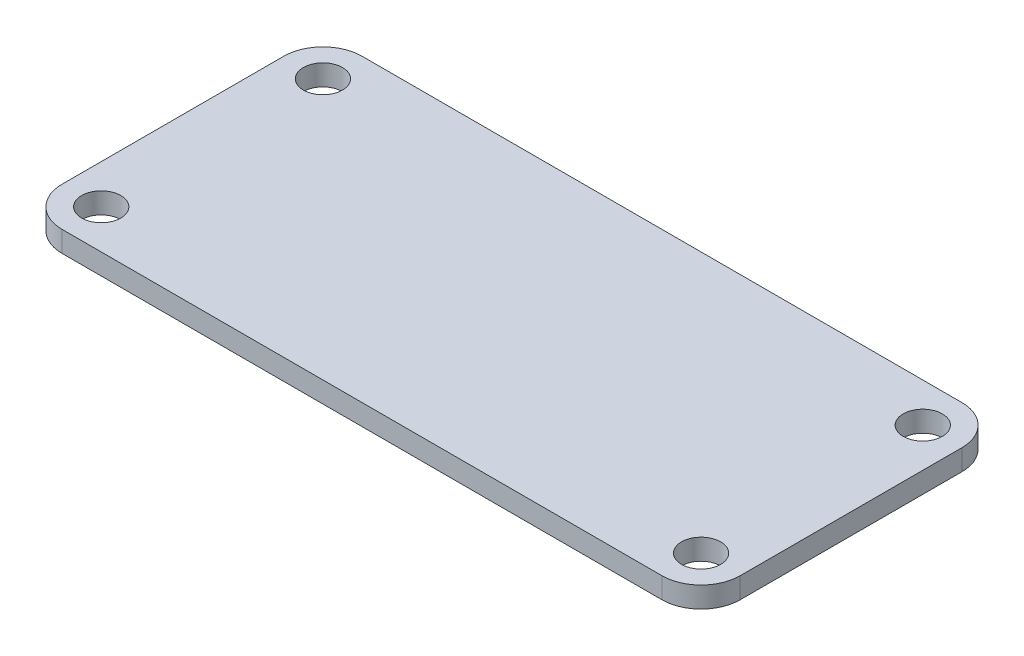
ISO-10303-21;
HEADER;
FILE_DESCRIPTION(('STEP AP214'),'2;1');
FILE_NAME('part.step','',(''),(''),'','','');
FILE_SCHEMA(('AUTOMOTIVE_DESIGN { 1 0 10303 214 1 1 1 1 }'));
ENDSEC;
DATA;
#1=APPLICATION_CONTEXT('core data for automotive mechanical design processes');
#2=APPLICATION_PROTOCOL_DEFINITION('international standard','automotive_design',2000,#1);
#3=PRODUCT_CONTEXT('',#1,'mechanical');
#4=PRODUCT('Part','Part','',(#3));
#5=PRODUCT_RELATED_PRODUCT_CATEGORY('part','',(#4));
#6=PRODUCT_DEFINITION_FORMATION('','',#4);
#7=PRODUCT_DEFINITION_CONTEXT('part definition',#1,'design');
#8=PRODUCT_DEFINITION('design','',#6,#7);
#9=PRODUCT_DEFINITION_SHAPE('','',#8);
#10=(LENGTH_UNIT() NAMED_UNIT(*) SI_UNIT(.MILLI.,.METRE.));
#11=(NAMED_UNIT(*) PLANE_ANGLE_UNIT() SI_UNIT($,.RADIAN.));
#12=(NAMED_UNIT(*) SI_UNIT($,.STERADIAN.) SOLID_ANGLE_UNIT());
#13=UNCERTAINTY_MEASURE_WITH_UNIT(LENGTH_MEASURE(1.E-05),#10,'distance_accuracy_value','');
#14=(GEOMETRIC_REPRESENTATION_CONTEXT(3) GLOBAL_UNCERTAINTY_ASSIGNED_CONTEXT((#13)) GLOBAL_UNIT_ASSIGNED_CONTEXT((#10,
#11,#12)) REPRESENTATION_CONTEXT('',''));
#15=CARTESIAN_POINT('',(0.,0.,0.));
#16=DIRECTION('',(0.,0.,1.));
#17=DIRECTION('',(1.,0.,0.));
#18=AXIS2_PLACEMENT_3D('',#15,#16,#17);
#19=CARTESIAN_POINT('',(26.,1.6,-11.5));
#20=DIRECTION('',(-1.,0.,0.));
#21=DIRECTION('',(0.,0.,1.));
#22=AXIS2_PLACEMENT_3D('',#19,#20,#21);
#23=PLANE('',#22);
#24=DIRECTION('',(0.,0.,-1.));
#25=VECTOR('',#24,1.);
#26=CARTESIAN_POINT('',(26.,0.,-11.5));
#27=LINE('',#26,#25);
#28=CARTESIAN_POINT('',(26.,0.,8.5));
#29=VERTEX_POINT('',#28);
#30=CARTESIAN_POINT('',(26.,0.,-8.5));
#31=VERTEX_POINT('',#30);
#32=EDGE_CURVE('E133',#29,#31,#27,.T.);
#33=ORIENTED_EDGE('',*,*,#32,.T.);
#34=DIRECTION('',(0.,-1.,0.));
#35=VECTOR('',#34,1.);
#36=CARTESIAN_POINT('',(26.,1.6,-8.5));
#37=LINE('',#36,#35);
#38=CARTESIAN_POINT('',(26.,1.6,-8.5));
#39=VERTEX_POINT('',#38);
#40=EDGE_CURVE('E11',#31,#39,#37,.F.);
#41=ORIENTED_EDGE('',*,*,#40,.T.);
#42=DIRECTION('',(0.,0.,-1.));
#43=VECTOR('',#42,1.);
#44=CARTESIAN_POINT('',(26.,1.6,-11.5));
#45=LINE('',#44,#43);
#46=CARTESIAN_POINT('',(26.,1.6,8.5));
#47=VERTEX_POINT('',#46);
#48=EDGE_CURVE('E131',#47,#39,#45,.T.);
#49=ORIENTED_EDGE('',*,*,#48,.F.);
#50=DIRECTION('',(0.,-1.,0.));
#51=VECTOR('',#50,1.);
#52=CARTESIAN_POINT('',(26.,1.6,8.5));
#53=LINE('',#52,#51);
#54=EDGE_CURVE('E44',#47,#29,#53,.T.);
#55=ORIENTED_EDGE('',*,*,#54,.T.);
#56=EDGE_LOOP('',(#33,#41,#49,#55));
#57=FACE_BOUND('',#56,.T.);
#58=ADVANCED_FACE('F35',(#57),#23,.F.);
#59=CARTESIAN_POINT('',(-26.,1.6,-11.5));
#60=DIRECTION('',(0.,0.,1.));
#61=DIRECTION('',(1.,0.,0.));
#62=AXIS2_PLACEMENT_3D('',#59,#60,#61);
#63=PLANE('',#62);
#64=DIRECTION('',(-1.,0.,0.));
#65=VECTOR('',#64,1.);
#66=CARTESIAN_POINT('',(-26.,0.,-11.5));
#67=LINE('',#66,#65);
#68=CARTESIAN_POINT('',(23.,0.,-11.5));
#69=VERTEX_POINT('',#68);
#70=CARTESIAN_POINT('',(-23.,0.,-11.5));
#71=VERTEX_POINT('',#70);
#72=EDGE_CURVE('E129',#69,#71,#67,.T.);
#73=ORIENTED_EDGE('',*,*,#72,.T.);
#74=DIRECTION('',(0.,-1.,0.));
#75=VECTOR('',#74,1.);
#76=CARTESIAN_POINT('',(-23.,1.6,-11.5));
#77=LINE('',#76,#75);
#78=CARTESIAN_POINT('',(-23.,1.6,-11.5));
#79=VERTEX_POINT('',#78);
#80=EDGE_CURVE('E108',#71,#79,#77,.F.);
#81=ORIENTED_EDGE('',*,*,#80,.T.);
#82=DIRECTION('',(-1.,0.,0.));
#83=VECTOR('',#82,1.);
#84=CARTESIAN_POINT('',(-26.,1.6,-11.5));
#85=LINE('',#84,#83);
#86=CARTESIAN_POINT('',(23.,1.6,-11.5));
#87=VERTEX_POINT('',#86);
#88=EDGE_CURVE('E179',#87,#79,#85,.T.);
#89=ORIENTED_EDGE('',*,*,#88,.F.);
#90=DIRECTION('',(0.,-1.,0.));
#91=VECTOR('',#90,1.);
#92=CARTESIAN_POINT('',(23.,1.6,-11.5));
#93=LINE('',#92,#91);
#94=EDGE_CURVE('E113',#87,#69,#93,.T.);
#95=ORIENTED_EDGE('',*,*,#94,.T.);
#96=EDGE_LOOP('',(#73,#81,#89,#95));
#97=FACE_BOUND('',#96,.T.);
#98=ADVANCED_FACE('F210',(#97),#63,.F.);
#99=CARTESIAN_POINT('',(-26.,1.6,-11.5));
#100=DIRECTION('',(1.,0.,0.));
#101=DIRECTION('',(0.,0.,-1.));
#102=AXIS2_PLACEMENT_3D('',#99,#100,#101);
#103=PLANE('',#102);
#104=DIRECTION('',(0.,0.,1.));
#105=VECTOR('',#104,1.);
#106=CARTESIAN_POINT('',(-26.,1.6,-11.5));
#107=LINE('',#106,#105);
#108=CARTESIAN_POINT('',(-26.,1.6,-8.5));
#109=VERTEX_POINT('',#108);
#110=CARTESIAN_POINT('',(-26.,1.6,8.5));
#111=VERTEX_POINT('',#110);
#112=EDGE_CURVE('E122',#109,#111,#107,.T.);
#113=ORIENTED_EDGE('',*,*,#112,.F.);
#114=DIRECTION('',(0.,-1.,0.));
#115=VECTOR('',#114,1.);
#116=CARTESIAN_POINT('',(-26.,1.6,-8.5));
#117=LINE('',#116,#115);
#118=CARTESIAN_POINT('',(-26.,0.,-8.5));
#119=VERTEX_POINT('',#118);
#120=EDGE_CURVE('E107',#109,#119,#117,.T.);
#121=ORIENTED_EDGE('',*,*,#120,.T.);
#122=DIRECTION('',(0.,0.,1.));
#123=VECTOR('',#122,1.);
#124=CARTESIAN_POINT('',(-26.,0.,-11.5));
#125=LINE('',#124,#123);
#126=CARTESIAN_POINT('',(-26.,0.,8.5));
#127=VERTEX_POINT('',#126);
#128=EDGE_CURVE('E120',#119,#127,#125,.T.);
#129=ORIENTED_EDGE('',*,*,#128,.T.);
#130=DIRECTION('',(0.,-1.,0.));
#131=VECTOR('',#130,1.);
#132=CARTESIAN_POINT('',(-26.,1.6,8.5));
#133=LINE('',#132,#131);
#134=EDGE_CURVE('E124',#127,#111,#133,.F.);
#135=ORIENTED_EDGE('',*,*,#134,.T.);
#136=EDGE_LOOP('',(#113,#121,#129,#135));
#137=FACE_BOUND('',#136,.T.);
#138=ADVANCED_FACE('F119',(#137),#103,.F.);
#139=CARTESIAN_POINT('',(-26.,1.6,11.5));
#140=DIRECTION('',(0.,0.,-1.));
#141=DIRECTION('',(-1.,0.,0.));
#142=AXIS2_PLACEMENT_3D('',#139,#140,#141);
#143=PLANE('',#142);
#144=DIRECTION('',(1.,0.,0.));
#145=VECTOR('',#144,1.);
#146=CARTESIAN_POINT('',(-26.,1.6,11.5));
#147=LINE('',#146,#145);
#148=CARTESIAN_POINT('',(-23.,1.6,11.5));
#149=VERTEX_POINT('',#148);
#150=CARTESIAN_POINT('',(23.,1.6,11.5));
#151=VERTEX_POINT('',#150);
#152=EDGE_CURVE('E137',#149,#151,#147,.T.);
#153=ORIENTED_EDGE('',*,*,#152,.F.);
#154=DIRECTION('',(0.,-1.,0.));
#155=VECTOR('',#154,1.);
#156=CARTESIAN_POINT('',(-23.,1.6,11.5));
#157=LINE('',#156,#155);
#158=CARTESIAN_POINT('',(-23.,0.,11.5));
#159=VERTEX_POINT('',#158);
#160=EDGE_CURVE('E154',#149,#159,#157,.T.);
#161=ORIENTED_EDGE('',*,*,#160,.T.);
#162=DIRECTION('',(1.,0.,0.));
#163=VECTOR('',#162,1.);
#164=CARTESIAN_POINT('',(-26.,0.,11.5));
#165=LINE('',#164,#163);
#166=CARTESIAN_POINT('',(23.,0.,11.5));
#167=VERTEX_POINT('',#166);
#168=EDGE_CURVE('E128',#159,#167,#165,.T.);
#169=ORIENTED_EDGE('',*,*,#168,.T.);
#170=DIRECTION('',(0.,-1.,0.));
#171=VECTOR('',#170,1.);
#172=CARTESIAN_POINT('',(23.,1.6,11.5));
#173=LINE('',#172,#171);
#174=EDGE_CURVE('E52',#167,#151,#173,.F.);
#175=ORIENTED_EDGE('',*,*,#174,.T.);
#176=EDGE_LOOP('',(#153,#161,#169,#175));
#177=FACE_BOUND('',#176,.T.);
#178=ADVANCED_FACE('F202',(#177),#143,.F.);
#179=CARTESIAN_POINT('',(0.,1.6,0.));
#180=DIRECTION('',(0.,1.,0.));
#181=DIRECTION('',(0.,0.,1.));
#182=AXIS2_PLACEMENT_3D('',#179,#180,#181);
#183=PLANE('',#182);
#184=CARTESIAN_POINT('',(-23.,1.6,8.5));
#185=DIRECTION('',(0.,1.,0.));
#186=DIRECTION('',(0.,0.,-1.));
#187=AXIS2_PLACEMENT_3D('',#184,#185,#186);
#188=CIRCLE('',#187,1.5);
#189=CARTESIAN_POINT('',(-23.,1.6,7.));
#190=VERTEX_POINT('',#189);
#191=EDGE_CURVE('E187',#190,#190,#188,.T.);
#192=ORIENTED_EDGE('',*,*,#191,.F.);
#193=EDGE_LOOP('',(#192));
#194=FACE_BOUND('',#193,.T.);
#195=CARTESIAN_POINT('',(23.,1.6,8.50000000000008));
#196=DIRECTION('',(0.,1.,0.));
#197=DIRECTION('',(0.,0.,1.));
#198=AXIS2_PLACEMENT_3D('',#195,#196,#197);
#199=CIRCLE('',#198,1.50000000000001);
#200=CARTESIAN_POINT('',(23.,1.6,10.0000000000001));
#201=VERTEX_POINT('',#200);
#202=EDGE_CURVE('E190',#201,#201,#199,.T.);
#203=ORIENTED_EDGE('',*,*,#202,.F.);
#204=EDGE_LOOP('',(#203));
#205=FACE_BOUND('',#204,.T.);
#206=CARTESIAN_POINT('',(23.,1.6,-8.50000000000008));
#207=DIRECTION('',(0.,1.,0.));
#208=DIRECTION('',(0.,0.,-1.));
#209=AXIS2_PLACEMENT_3D('',#206,#207,#208);
#210=CIRCLE('',#209,1.50000000000001);
#211=CARTESIAN_POINT('',(23.,1.6,-10.0000000000001));
#212=VERTEX_POINT('',#211);
#213=EDGE_CURVE('E186',#212,#212,#210,.T.);
#214=ORIENTED_EDGE('',*,*,#213,.F.);
#215=EDGE_LOOP('',(#214));
#216=FACE_BOUND('',#215,.T.);
#217=CARTESIAN_POINT('',(-23.,1.6,-8.5));
#218=DIRECTION('',(0.,1.,0.));
#219=DIRECTION('',(0.,0.,1.));
#220=AXIS2_PLACEMENT_3D('',#217,#218,#219);
#221=CIRCLE('',#220,1.5);
#222=CARTESIAN_POINT('',(-23.,1.6,-7.));
#223=VERTEX_POINT('',#222);
#224=EDGE_CURVE('E163',#223,#223,#221,.T.);
#225=ORIENTED_EDGE('',*,*,#224,.F.);
#226=EDGE_LOOP('',(#225));
#227=FACE_BOUND('',#226,.T.);
#228=ORIENTED_EDGE('',*,*,#88,.T.);
#229=CARTESIAN_POINT('',(-23.,1.6,-8.5));
#230=DIRECTION('',(0.,1.,0.));
#231=DIRECTION('',(0.,0.,1.));
#232=AXIS2_PLACEMENT_3D('',#229,#230,#231);
#233=CIRCLE('',#232,3.);
#234=EDGE_CURVE('E151',#79,#109,#233,.T.);
#235=ORIENTED_EDGE('',*,*,#234,.T.);
#236=ORIENTED_EDGE('',*,*,#112,.T.);
#237=CARTESIAN_POINT('',(-23.,1.6,8.5));
#238=DIRECTION('',(0.,1.,0.));
#239=DIRECTION('',(0.,0.,1.));
#240=AXIS2_PLACEMENT_3D('',#237,#238,#239);
#241=CIRCLE('',#240,3.);
#242=EDGE_CURVE('E59',#111,#149,#241,.T.);
#243=ORIENTED_EDGE('',*,*,#242,.T.);
#244=ORIENTED_EDGE('',*,*,#152,.T.);
#245=CARTESIAN_POINT('',(23.,1.6,8.5));
#246=DIRECTION('',(0.,1.,0.));
#247=DIRECTION('',(0.,0.,1.));
#248=AXIS2_PLACEMENT_3D('',#245,#246,#247);
#249=CIRCLE('',#248,3.);
#250=EDGE_CURVE('E146',#151,#47,#249,.T.);
#251=ORIENTED_EDGE('',*,*,#250,.T.);
#252=ORIENTED_EDGE('',*,*,#48,.T.);
#253=CARTESIAN_POINT('',(23.,1.6,-8.5));
#254=DIRECTION('',(0.,1.,0.));
#255=DIRECTION('',(0.,0.,1.));
#256=AXIS2_PLACEMENT_3D('',#253,#254,#255);
#257=CIRCLE('',#256,3.);
#258=EDGE_CURVE('E148',#39,#87,#257,.T.);
#259=ORIENTED_EDGE('',*,*,#258,.T.);
#260=EDGE_LOOP('',(#228,#235,#236,#243,#244,#251,#252,#259));
#261=FACE_BOUND('',#260,.T.);
#262=ADVANCED_FACE('F199',(#194,#205,#216,#227,#261),#183,.T.);
#263=CARTESIAN_POINT('',(0.,0.,0.));
#264=DIRECTION('',(0.,1.,0.));
#265=DIRECTION('',(0.,0.,1.));
#266=AXIS2_PLACEMENT_3D('',#263,#264,#265);
#267=PLANE('',#266);
#268=CARTESIAN_POINT('',(-23.,0.,8.5));
#269=DIRECTION('',(0.,1.,0.));
#270=DIRECTION('',(0.,0.,1.));
#271=AXIS2_PLACEMENT_3D('',#268,#269,#270);
#272=CIRCLE('',#271,1.5);
#273=CARTESIAN_POINT('',(-23.,0.,10.));
#274=VERTEX_POINT('',#273);
#275=EDGE_CURVE('E39',#274,#274,#272,.T.);
#276=ORIENTED_EDGE('',*,*,#275,.T.);
#277=EDGE_LOOP('',(#276));
#278=FACE_BOUND('',#277,.T.);
#279=CARTESIAN_POINT('',(23.,0.,8.50000000000008));
#280=DIRECTION('',(0.,1.,0.));
#281=DIRECTION('',(0.,0.,1.));
#282=AXIS2_PLACEMENT_3D('',#279,#280,#281);
#283=CIRCLE('',#282,1.50000000000001);
#284=CARTESIAN_POINT('',(23.,0.,10.0000000000001));
#285=VERTEX_POINT('',#284);
#286=EDGE_CURVE('E165',#285,#285,#283,.T.);
#287=ORIENTED_EDGE('',*,*,#286,.T.);
#288=EDGE_LOOP('',(#287));
#289=FACE_BOUND('',#288,.T.);
#290=CARTESIAN_POINT('',(23.,0.,-8.50000000000008));
#291=DIRECTION('',(0.,1.,0.));
#292=DIRECTION('',(0.,0.,1.));
#293=AXIS2_PLACEMENT_3D('',#290,#291,#292);
#294=CIRCLE('',#293,1.50000000000001);
#295=CARTESIAN_POINT('',(23.,0.,-7.00000000000008));
#296=VERTEX_POINT('',#295);
#297=EDGE_CURVE('E162',#296,#296,#294,.T.);
#298=ORIENTED_EDGE('',*,*,#297,.T.);
#299=EDGE_LOOP('',(#298));
#300=FACE_BOUND('',#299,.T.);
#301=CARTESIAN_POINT('',(-23.,0.,-8.5));
#302=DIRECTION('',(0.,1.,0.));
#303=DIRECTION('',(0.,0.,1.));
#304=AXIS2_PLACEMENT_3D('',#301,#302,#303);
#305=CIRCLE('',#304,1.5);
#306=CARTESIAN_POINT('',(-23.,0.,-7.));
#307=VERTEX_POINT('',#306);
#308=EDGE_CURVE('E159',#307,#307,#305,.T.);
#309=ORIENTED_EDGE('',*,*,#308,.T.);
#310=EDGE_LOOP('',(#309));
#311=FACE_BOUND('',#310,.T.);
#312=ORIENTED_EDGE('',*,*,#128,.F.);
#313=CARTESIAN_POINT('',(-23.,0.,-8.5));
#314=DIRECTION('',(0.,1.,0.));
#315=DIRECTION('',(0.,0.,1.));
#316=AXIS2_PLACEMENT_3D('',#313,#314,#315);
#317=CIRCLE('',#316,3.);
#318=EDGE_CURVE('E103',#119,#71,#317,.F.);
#319=ORIENTED_EDGE('',*,*,#318,.T.);
#320=ORIENTED_EDGE('',*,*,#72,.F.);
#321=CARTESIAN_POINT('',(23.,0.,-8.5));
#322=DIRECTION('',(0.,1.,0.));
#323=DIRECTION('',(0.,0.,1.));
#324=AXIS2_PLACEMENT_3D('',#321,#322,#323);
#325=CIRCLE('',#324,3.);
#326=EDGE_CURVE('E140',#69,#31,#325,.F.);
#327=ORIENTED_EDGE('',*,*,#326,.T.);
#328=ORIENTED_EDGE('',*,*,#32,.F.);
#329=CARTESIAN_POINT('',(23.,0.,8.5));
#330=DIRECTION('',(0.,1.,0.));
#331=DIRECTION('',(0.,0.,1.));
#332=AXIS2_PLACEMENT_3D('',#329,#330,#331);
#333=CIRCLE('',#332,3.);
#334=EDGE_CURVE('E123',#29,#167,#333,.F.);
#335=ORIENTED_EDGE('',*,*,#334,.T.);
#336=ORIENTED_EDGE('',*,*,#168,.F.);
#337=CARTESIAN_POINT('',(-23.,0.,8.5));
#338=DIRECTION('',(0.,1.,0.));
#339=DIRECTION('',(0.,0.,1.));
#340=AXIS2_PLACEMENT_3D('',#337,#338,#339);
#341=CIRCLE('',#340,3.);
#342=EDGE_CURVE('E114',#159,#127,#341,.F.);
#343=ORIENTED_EDGE('',*,*,#342,.T.);
#344=EDGE_LOOP('',(#312,#319,#320,#327,#328,#335,#336,#343));
#345=FACE_BOUND('',#344,.T.);
#346=ADVANCED_FACE('F126',(#278,#289,#300,#311,#345),#267,.F.);
#347=CARTESIAN_POINT('',(-23.,1.6,-8.5));
#348=DIRECTION('',(0.,-1.,0.));
#349=DIRECTION('',(0.,0.,-1.));
#350=AXIS2_PLACEMENT_3D('',#347,#348,#349);
#351=CYLINDRICAL_SURFACE('',#350,3.);
#352=ORIENTED_EDGE('',*,*,#234,.F.);
#353=ORIENTED_EDGE('',*,*,#80,.F.);
#354=ORIENTED_EDGE('',*,*,#318,.F.);
#355=ORIENTED_EDGE('',*,*,#120,.F.);
#356=EDGE_LOOP('',(#352,#353,#354,#355));
#357=FACE_BOUND('',#356,.T.);
#358=ADVANCED_FACE('F106',(#357),#351,.T.);
#359=CARTESIAN_POINT('',(-23.,1.6,8.5));
#360=DIRECTION('',(0.,-1.,0.));
#361=DIRECTION('',(0.,0.,-1.));
#362=AXIS2_PLACEMENT_3D('',#359,#360,#361);
#363=CYLINDRICAL_SURFACE('',#362,3.);
#364=ORIENTED_EDGE('',*,*,#242,.F.);
#365=ORIENTED_EDGE('',*,*,#134,.F.);
#366=ORIENTED_EDGE('',*,*,#342,.F.);
#367=ORIENTED_EDGE('',*,*,#160,.F.);
#368=EDGE_LOOP('',(#364,#365,#366,#367));
#369=FACE_BOUND('',#368,.T.);
#370=ADVANCED_FACE('F228',(#369),#363,.T.);
#371=CARTESIAN_POINT('',(23.,1.6,-8.5));
#372=DIRECTION('',(0.,-1.,0.));
#373=DIRECTION('',(0.,0.,-1.));
#374=AXIS2_PLACEMENT_3D('',#371,#372,#373);
#375=CYLINDRICAL_SURFACE('',#374,3.);
#376=ORIENTED_EDGE('',*,*,#258,.F.);
#377=ORIENTED_EDGE('',*,*,#40,.F.);
#378=ORIENTED_EDGE('',*,*,#326,.F.);
#379=ORIENTED_EDGE('',*,*,#94,.F.);
#380=EDGE_LOOP('',(#376,#377,#378,#379));
#381=FACE_BOUND('',#380,.T.);
#382=ADVANCED_FACE('F212',(#381),#375,.T.);
#383=CARTESIAN_POINT('',(23.,1.6,8.5));
#384=DIRECTION('',(0.,-1.,0.));
#385=DIRECTION('',(0.,0.,-1.));
#386=AXIS2_PLACEMENT_3D('',#383,#384,#385);
#387=CYLINDRICAL_SURFACE('',#386,3.);
#388=ORIENTED_EDGE('',*,*,#250,.F.);
#389=ORIENTED_EDGE('',*,*,#174,.F.);
#390=ORIENTED_EDGE('',*,*,#334,.F.);
#391=ORIENTED_EDGE('',*,*,#54,.F.);
#392=EDGE_LOOP('',(#388,#389,#390,#391));
#393=FACE_BOUND('',#392,.T.);
#394=ADVANCED_FACE('F37',(#393),#387,.T.);
#395=CARTESIAN_POINT('',(-23.,-8.4,-8.5));
#396=DIRECTION('',(0.,1.,0.));
#397=DIRECTION('',(0.,0.,1.));
#398=AXIS2_PLACEMENT_3D('',#395,#396,#397);
#399=CYLINDRICAL_SURFACE('',#398,1.5);
#400=ORIENTED_EDGE('',*,*,#224,.T.);
#401=EDGE_LOOP('',(#400));
#402=FACE_BOUND('',#401,.T.);
#403=ORIENTED_EDGE('',*,*,#308,.F.);
#404=EDGE_LOOP('',(#403));
#405=FACE_BOUND('',#404,.T.);
#406=ADVANCED_FACE('F235',(#402,#405),#399,.F.);
#407=CARTESIAN_POINT('',(23.,-8.4,-8.50000000000008));
#408=DIRECTION('',(0.,1.,0.));
#409=DIRECTION('',(0.,0.,1.));
#410=AXIS2_PLACEMENT_3D('',#407,#408,#409);
#411=CYLINDRICAL_SURFACE('',#410,1.50000000000001);
#412=ORIENTED_EDGE('',*,*,#213,.T.);
#413=EDGE_LOOP('',(#412));
#414=FACE_BOUND('',#413,.T.);
#415=ORIENTED_EDGE('',*,*,#297,.F.);
#416=EDGE_LOOP('',(#415));
#417=FACE_BOUND('',#416,.T.);
#418=ADVANCED_FACE('F196',(#414,#417),#411,.F.);
#419=CARTESIAN_POINT('',(23.,-8.4,8.50000000000008));
#420=DIRECTION('',(0.,1.,0.));
#421=DIRECTION('',(0.,0.,1.));
#422=AXIS2_PLACEMENT_3D('',#419,#420,#421);
#423=CYLINDRICAL_SURFACE('',#422,1.50000000000001);
#424=ORIENTED_EDGE('',*,*,#202,.T.);
#425=EDGE_LOOP('',(#424));
#426=FACE_BOUND('',#425,.T.);
#427=ORIENTED_EDGE('',*,*,#286,.F.);
#428=EDGE_LOOP('',(#427));
#429=FACE_BOUND('',#428,.T.);
#430=ADVANCED_FACE('F244',(#426,#429),#423,.F.);
#431=CARTESIAN_POINT('',(-23.,-8.4,8.5));
#432=DIRECTION('',(0.,1.,0.));
#433=DIRECTION('',(0.,0.,1.));
#434=AXIS2_PLACEMENT_3D('',#431,#432,#433);
#435=CYLINDRICAL_SURFACE('',#434,1.5);
#436=ORIENTED_EDGE('',*,*,#191,.T.);
#437=EDGE_LOOP('',(#436));
#438=FACE_BOUND('',#437,.T.);
#439=ORIENTED_EDGE('',*,*,#275,.F.);
#440=EDGE_LOOP('',(#439));
#441=FACE_BOUND('',#440,.T.);
#442=ADVANCED_FACE('F248',(#438,#441),#435,.F.);
#443=CLOSED_SHELL('',(#58,#98,#138,#178,#262,#346,#358,#370,#382,#394,#406,#418,#430,#442));
#444=MANIFOLD_SOLID_BREP('B2',#443);
#445=ADVANCED_BREP_SHAPE_REPRESENTATION('',(#18,#444),#14);
#446=SHAPE_DEFINITION_REPRESENTATION(#9,#445);
ENDSEC;
END-ISO-10303-21;
